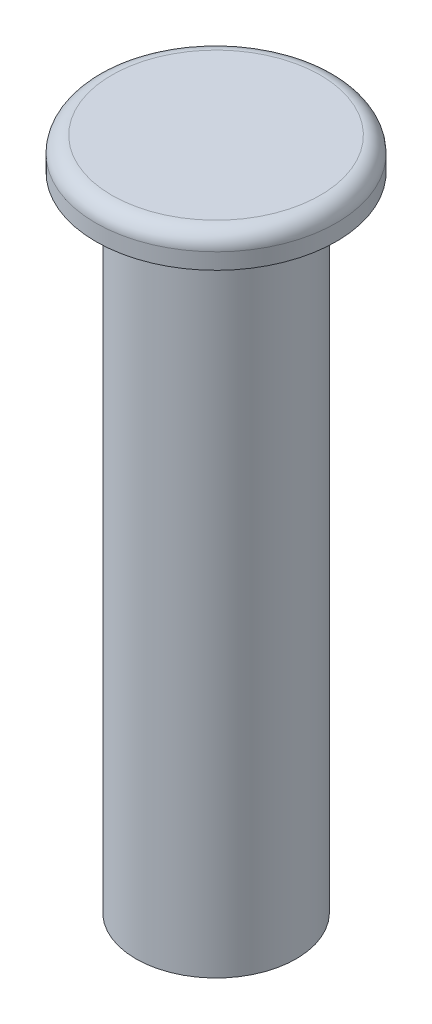
ISO-10303-21;
HEADER;
FILE_DESCRIPTION(('STEP AP214'),'2;1');
FILE_NAME('part.step','',(''),(''),'','','');
FILE_SCHEMA(('AUTOMOTIVE_DESIGN { 1 0 10303 214 1 1 1 1 }'));
ENDSEC;
DATA;
#1=APPLICATION_CONTEXT('core data for automotive mechanical design processes');
#2=APPLICATION_PROTOCOL_DEFINITION('international standard','automotive_design',2000,#1);
#3=PRODUCT_CONTEXT('',#1,'mechanical');
#4=PRODUCT('Part','Part','',(#3));
#5=PRODUCT_RELATED_PRODUCT_CATEGORY('part','',(#4));
#6=PRODUCT_DEFINITION_FORMATION('','',#4);
#7=PRODUCT_DEFINITION_CONTEXT('part definition',#1,'design');
#8=PRODUCT_DEFINITION('design','',#6,#7);
#9=PRODUCT_DEFINITION_SHAPE('','',#8);
#10=(LENGTH_UNIT() NAMED_UNIT(*) SI_UNIT(.MILLI.,.METRE.));
#11=(NAMED_UNIT(*) PLANE_ANGLE_UNIT() SI_UNIT($,.RADIAN.));
#12=(NAMED_UNIT(*) SI_UNIT($,.STERADIAN.) SOLID_ANGLE_UNIT());
#13=UNCERTAINTY_MEASURE_WITH_UNIT(LENGTH_MEASURE(1.E-05),#10,'distance_accuracy_value','');
#14=(GEOMETRIC_REPRESENTATION_CONTEXT(3) GLOBAL_UNCERTAINTY_ASSIGNED_CONTEXT((#13)) GLOBAL_UNIT_ASSIGNED_CONTEXT((#10,
#11,#12)) REPRESENTATION_CONTEXT('',''));
#15=CARTESIAN_POINT('',(0.,0.,0.));
#16=DIRECTION('',(0.,0.,1.));
#17=DIRECTION('',(1.,0.,0.));
#18=AXIS2_PLACEMENT_3D('',#15,#16,#17);
#19=CARTESIAN_POINT('',(0.,4.,0.));
#20=DIRECTION('',(0.,-1.,0.));
#21=DIRECTION('',(0.,0.,-1.));
#22=AXIS2_PLACEMENT_3D('',#19,#20,#21);
#23=CYLINDRICAL_SURFACE('',#22,0.5);
#24=CARTESIAN_POINT('',(0.,4.,0.));
#25=DIRECTION('',(0.,1.,0.));
#26=DIRECTION('',(0.,0.,1.));
#27=AXIS2_PLACEMENT_3D('',#24,#25,#26);
#28=CIRCLE('',#27,0.5);
#29=CARTESIAN_POINT('',(0.,4.,0.5));
#30=VERTEX_POINT('',#29);
#31=EDGE_CURVE('E43',#30,#30,#28,.T.);
#32=ORIENTED_EDGE('',*,*,#31,.F.);
#33=EDGE_LOOP('',(#32));
#34=FACE_BOUND('',#33,.T.);
#35=CARTESIAN_POINT('',(0.,0.,0.));
#36=DIRECTION('',(0.,1.,0.));
#37=DIRECTION('',(0.,0.,1.));
#38=AXIS2_PLACEMENT_3D('',#35,#36,#37);
#39=CIRCLE('',#38,0.5);
#40=CARTESIAN_POINT('',(0.,0.,0.5));
#41=VERTEX_POINT('',#40);
#42=EDGE_CURVE('E47',#41,#41,#39,.T.);
#43=ORIENTED_EDGE('',*,*,#42,.T.);
#44=EDGE_LOOP('',(#43));
#45=FACE_BOUND('',#44,.T.);
#46=ADVANCED_FACE('F32',(#34,#45),#23,.T.);
#47=CARTESIAN_POINT('',(0.,0.,0.));
#48=DIRECTION('',(0.,1.,0.));
#49=DIRECTION('',(0.,0.,1.));
#50=AXIS2_PLACEMENT_3D('',#47,#48,#49);
#51=PLANE('',#50);
#52=ORIENTED_EDGE('',*,*,#42,.F.);
#53=EDGE_LOOP('',(#52));
#54=FACE_BOUND('',#53,.T.);
#55=ADVANCED_FACE('F71',(#54),#51,.F.);
#56=CARTESIAN_POINT('',(0.,4.2,0.));
#57=DIRECTION('',(0.,-1.,0.));
#58=DIRECTION('',(0.,0.,-1.));
#59=AXIS2_PLACEMENT_3D('',#56,#57,#58);
#60=CYLINDRICAL_SURFACE('',#59,0.75);
#61=CARTESIAN_POINT('',(0.,4.1,0.));
#62=DIRECTION('',(0.,1.,0.));
#63=DIRECTION('',(0.,0.,1.));
#64=AXIS2_PLACEMENT_3D('',#61,#62,#63);
#65=CIRCLE('',#64,0.75);
#66=CARTESIAN_POINT('',(0.,4.1,0.75));
#67=VERTEX_POINT('',#66);
#68=EDGE_CURVE('E10',#67,#67,#65,.F.);
#69=ORIENTED_EDGE('',*,*,#68,.T.);
#70=EDGE_LOOP('',(#69));
#71=FACE_BOUND('',#70,.T.);
#72=CARTESIAN_POINT('',(0.,4.,0.));
#73=DIRECTION('',(0.,1.,0.));
#74=DIRECTION('',(0.,0.,1.));
#75=AXIS2_PLACEMENT_3D('',#72,#73,#74);
#76=CIRCLE('',#75,0.75);
#77=CARTESIAN_POINT('',(0.,4.,0.75));
#78=VERTEX_POINT('',#77);
#79=EDGE_CURVE('E51',#78,#78,#76,.T.);
#80=ORIENTED_EDGE('',*,*,#79,.T.);
#81=EDGE_LOOP('',(#80));
#82=FACE_BOUND('',#81,.T.);
#83=ADVANCED_FACE('F56',(#71,#82),#60,.T.);
#84=CARTESIAN_POINT('',(0.,4.2,0.));
#85=DIRECTION('',(0.,1.,0.));
#86=DIRECTION('',(0.,0.,1.));
#87=AXIS2_PLACEMENT_3D('',#84,#85,#86);
#88=PLANE('',#87);
#89=CARTESIAN_POINT('',(0.,4.2,0.));
#90=DIRECTION('',(0.,1.,0.));
#91=DIRECTION('',(0.,0.,1.));
#92=AXIS2_PLACEMENT_3D('',#89,#90,#91);
#93=CIRCLE('',#92,0.65);
#94=CARTESIAN_POINT('',(0.,4.2,0.65));
#95=VERTEX_POINT('',#94);
#96=EDGE_CURVE('E39',#95,#95,#93,.T.);
#97=ORIENTED_EDGE('',*,*,#96,.T.);
#98=EDGE_LOOP('',(#97));
#99=FACE_BOUND('',#98,.T.);
#100=ADVANCED_FACE('F60',(#99),#88,.T.);
#101=CARTESIAN_POINT('',(0.,4.,0.));
#102=DIRECTION('',(0.,1.,0.));
#103=DIRECTION('',(0.,0.,1.));
#104=AXIS2_PLACEMENT_3D('',#101,#102,#103);
#105=PLANE('',#104);
#106=ORIENTED_EDGE('',*,*,#31,.T.);
#107=EDGE_LOOP('',(#106));
#108=FACE_BOUND('',#107,.T.);
#109=ORIENTED_EDGE('',*,*,#79,.F.);
#110=EDGE_LOOP('',(#109));
#111=FACE_BOUND('',#110,.T.);
#112=ADVANCED_FACE('F58',(#108,#111),#105,.F.);
#113=CARTESIAN_POINT('',(0.,4.1,0.));
#114=DIRECTION('',(0.,1.,0.));
#115=DIRECTION('',(0.,0.,1.));
#116=AXIS2_PLACEMENT_3D('',#113,#114,#115);
#117=TOROIDAL_SURFACE('',#116,0.65,0.1);
#118=ORIENTED_EDGE('',*,*,#68,.F.);
#119=EDGE_LOOP('',(#118));
#120=FACE_BOUND('',#119,.T.);
#121=ORIENTED_EDGE('',*,*,#96,.F.);
#122=EDGE_LOOP('',(#121));
#123=FACE_BOUND('',#122,.T.);
#124=ADVANCED_FACE('F34',(#120,#123),#117,.T.);
#125=CLOSED_SHELL('',(#46,#55,#83,#100,#112,#124));
#126=MANIFOLD_SOLID_BREP('B2',#125);
#127=ADVANCED_BREP_SHAPE_REPRESENTATION('',(#18,#126),#14);
#128=SHAPE_DEFINITION_REPRESENTATION(#9,#127);
ENDSEC;
END-ISO-10303-21;
